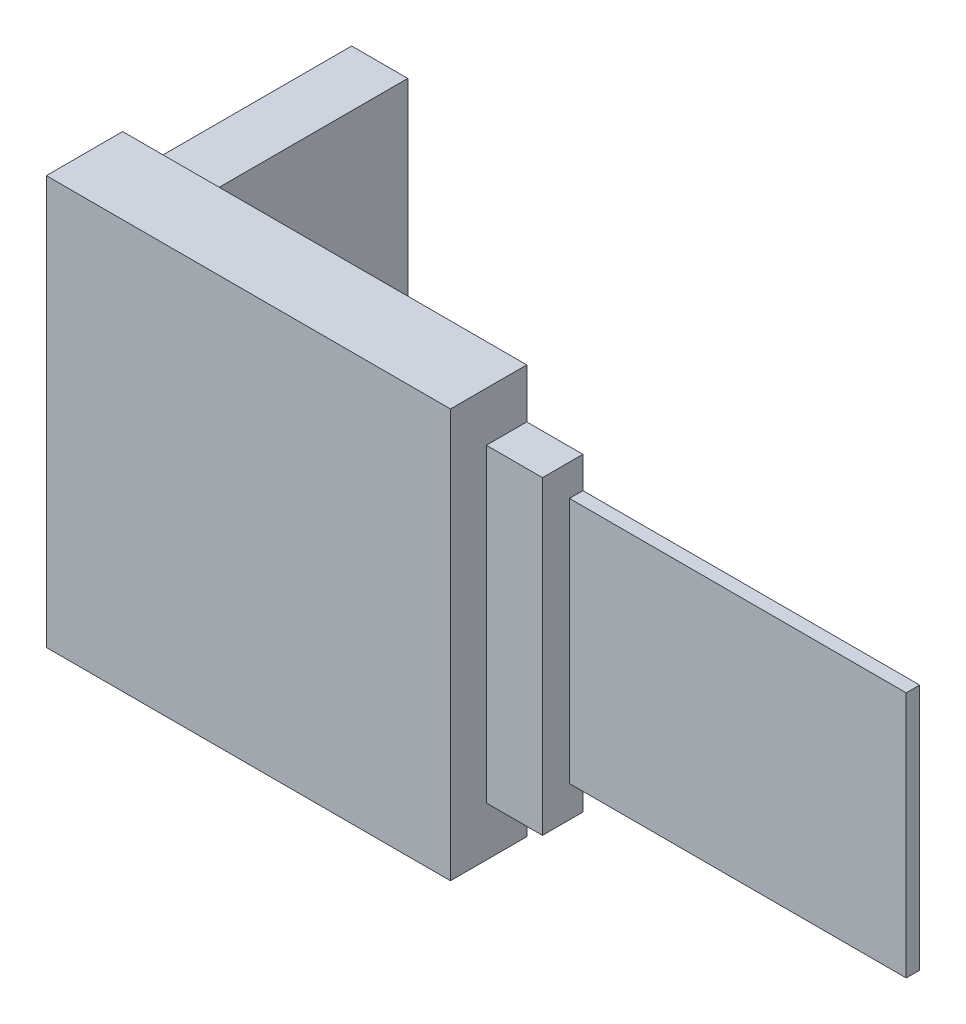
ISO-10303-21;
HEADER;
FILE_DESCRIPTION(('STEP AP214'),'2;1');
FILE_NAME('part.step','',(''),(''),'','','');
FILE_SCHEMA(('AUTOMOTIVE_DESIGN { 1 0 10303 214 1 1 1 1 }'));
ENDSEC;
DATA;
#1=APPLICATION_CONTEXT('core data for automotive mechanical design processes');
#2=APPLICATION_PROTOCOL_DEFINITION('international standard','automotive_design',2000,#1);
#3=PRODUCT_CONTEXT('',#1,'mechanical');
#4=PRODUCT('Part','Part','',(#3));
#5=PRODUCT_RELATED_PRODUCT_CATEGORY('part','',(#4));
#6=PRODUCT_DEFINITION_FORMATION('','',#4);
#7=PRODUCT_DEFINITION_CONTEXT('part definition',#1,'design');
#8=PRODUCT_DEFINITION('design','',#6,#7);
#9=PRODUCT_DEFINITION_SHAPE('','',#8);
#10=(LENGTH_UNIT() NAMED_UNIT(*) SI_UNIT(.MILLI.,.METRE.));
#11=(NAMED_UNIT(*) PLANE_ANGLE_UNIT() SI_UNIT($,.RADIAN.));
#12=(NAMED_UNIT(*) SI_UNIT($,.STERADIAN.) SOLID_ANGLE_UNIT());
#13=UNCERTAINTY_MEASURE_WITH_UNIT(LENGTH_MEASURE(1.E-05),#10,'distance_accuracy_value','');
#14=(GEOMETRIC_REPRESENTATION_CONTEXT(3) GLOBAL_UNCERTAINTY_ASSIGNED_CONTEXT((#13)) GLOBAL_UNIT_ASSIGNED_CONTEXT((#10,
#11,#12)) REPRESENTATION_CONTEXT('',''));
#15=CARTESIAN_POINT('',(0.,0.,0.));
#16=DIRECTION('',(0.,0.,1.));
#17=DIRECTION('',(1.,0.,0.));
#18=AXIS2_PLACEMENT_3D('',#15,#16,#17);
#19=CARTESIAN_POINT('',(-30.0344801548384,-68.5074440446685,3.4));
#20=DIRECTION('',(-1.,0.,0.));
#21=DIRECTION('',(0.,-1.,0.));
#22=AXIS2_PLACEMENT_3D('',#19,#20,#21);
#23=PLANE('',#22);
#24=DIRECTION('',(0.,0.,-1.));
#25=VECTOR('',#24,1.);
#26=CARTESIAN_POINT('',(-30.0344801548384,-84.5074440446685,1.8));
#27=LINE('',#26,#25);
#28=CARTESIAN_POINT('',(-30.0344801548384,-84.5074440446685,1.8));
#29=VERTEX_POINT('',#28);
#30=CARTESIAN_POINT('',(-30.0344801548384,-84.5074440446685,0.));
#31=VERTEX_POINT('',#30);
#32=EDGE_CURVE('E209',#29,#31,#27,.T.);
#33=ORIENTED_EDGE('',*,*,#32,.F.);
#34=DIRECTION('',(0.,1.,0.));
#35=VECTOR('',#34,1.);
#36=CARTESIAN_POINT('',(-30.0344801548384,-84.5074440446685,1.8));
#37=LINE('',#36,#35);
#38=CARTESIAN_POINT('',(-30.0344801548384,-70.7074440446685,1.8));
#39=VERTEX_POINT('',#38);
#40=EDGE_CURVE('E190',#29,#39,#37,.T.);
#41=ORIENTED_EDGE('',*,*,#40,.T.);
#42=DIRECTION('',(0.,0.,-1.));
#43=VECTOR('',#42,1.);
#44=CARTESIAN_POINT('',(-30.0344801548384,-70.7074440446685,1.8));
#45=LINE('',#44,#43);
#46=CARTESIAN_POINT('',(-30.0344801548384,-70.7074440446685,0.));
#47=VERTEX_POINT('',#46);
#48=EDGE_CURVE('E207',#39,#47,#45,.T.);
#49=ORIENTED_EDGE('',*,*,#48,.T.);
#50=DIRECTION('',(0.,1.,0.));
#51=VECTOR('',#50,1.);
#52=CARTESIAN_POINT('',(-30.0344801548384,-68.5074440446685,0.));
#53=LINE('',#52,#51);
#54=CARTESIAN_POINT('',(-30.0344801548384,-68.5074440446685,0.));
#55=VERTEX_POINT('',#54);
#56=EDGE_CURVE('E261',#47,#55,#53,.T.);
#57=ORIENTED_EDGE('',*,*,#56,.T.);
#58=DIRECTION('',(0.,0.,-1.));
#59=VECTOR('',#58,1.);
#60=CARTESIAN_POINT('',(-30.0344801548384,-68.5074440446685,3.4));
#61=LINE('',#60,#59);
#62=CARTESIAN_POINT('',(-30.0344801548384,-68.5074440446685,3.4));
#63=VERTEX_POINT('',#62);
#64=EDGE_CURVE('E268',#63,#55,#61,.T.);
#65=ORIENTED_EDGE('',*,*,#64,.F.);
#66=DIRECTION('',(0.,1.,0.));
#67=VECTOR('',#66,1.);
#68=CARTESIAN_POINT('',(-30.0344801548384,-68.5074440446685,3.4));
#69=LINE('',#68,#67);
#70=CARTESIAN_POINT('',(-30.0344801548384,-86.7074440446685,3.4));
#71=VERTEX_POINT('',#70);
#72=EDGE_CURVE('E252',#71,#63,#69,.T.);
#73=ORIENTED_EDGE('',*,*,#72,.F.);
#74=DIRECTION('',(0.,0.,-1.));
#75=VECTOR('',#74,1.);
#76=CARTESIAN_POINT('',(-30.0344801548384,-86.7074440446685,3.4));
#77=LINE('',#76,#75);
#78=CARTESIAN_POINT('',(-30.0344801548384,-86.7074440446685,0.));
#79=VERTEX_POINT('',#78);
#80=EDGE_CURVE('E41',#71,#79,#77,.T.);
#81=ORIENTED_EDGE('',*,*,#80,.T.);
#82=EDGE_CURVE('E262',#79,#31,#53,.T.);
#83=ORIENTED_EDGE('',*,*,#82,.T.);
#84=EDGE_LOOP('',(#33,#41,#49,#57,#65,#73,#81,#83));
#85=FACE_BOUND('',#84,.T.);
#86=ADVANCED_FACE('F33',(#85),#23,.F.);
#87=CARTESIAN_POINT('',(0.,0.,0.));
#88=DIRECTION('',(0.,0.,1.));
#89=DIRECTION('',(1.,0.,0.));
#90=AXIS2_PLACEMENT_3D('',#87,#88,#89);
#91=PLANE('',#90);
#92=DIRECTION('',(0.,-1.,0.));
#93=VECTOR('',#92,1.);
#94=CARTESIAN_POINT('',(-48.0344801548384,-68.5074440446685,0.));
#95=LINE('',#94,#93);
#96=CARTESIAN_POINT('',(-48.0344801548384,-68.5074440446685,0.));
#97=VERTEX_POINT('',#96);
#98=CARTESIAN_POINT('',(-48.0344801548384,-86.7074440446685,0.));
#99=VERTEX_POINT('',#98);
#100=EDGE_CURVE('E245',#97,#99,#95,.T.);
#101=ORIENTED_EDGE('',*,*,#100,.F.);
#102=DIRECTION('',(-1.,0.,0.));
#103=VECTOR('',#102,1.);
#104=CARTESIAN_POINT('',(-48.0344801548384,-68.5074440446685,0.));
#105=LINE('',#104,#103);
#106=EDGE_CURVE('E250',#55,#97,#105,.T.);
#107=ORIENTED_EDGE('',*,*,#106,.F.);
#108=ORIENTED_EDGE('',*,*,#56,.F.);
#109=DIRECTION('',(1.,0.,0.));
#110=VECTOR('',#109,1.);
#111=CARTESIAN_POINT('',(-27.5344801548384,-70.7074440446685,0.));
#112=LINE('',#111,#110);
#113=CARTESIAN_POINT('',(-27.5344801548384,-70.7074440446685,0.));
#114=VERTEX_POINT('',#113);
#115=EDGE_CURVE('E56',#47,#114,#112,.T.);
#116=ORIENTED_EDGE('',*,*,#115,.T.);
#117=DIRECTION('',(0.,-1.,0.));
#118=VECTOR('',#117,1.);
#119=CARTESIAN_POINT('',(-27.5344801548384,-84.5074440446685,0.));
#120=LINE('',#119,#118);
#121=CARTESIAN_POINT('',(-27.5344801548384,-72.1074440446685,0.));
#122=VERTEX_POINT('',#121);
#123=EDGE_CURVE('E197',#114,#122,#120,.T.);
#124=ORIENTED_EDGE('',*,*,#123,.T.);
#125=DIRECTION('',(1.,0.,0.));
#126=VECTOR('',#125,1.);
#127=CARTESIAN_POINT('',(-12.5344801548384,-72.1074440446685,0.));
#128=LINE('',#127,#126);
#129=CARTESIAN_POINT('',(-12.5344801548384,-72.1074440446685,0.));
#130=VERTEX_POINT('',#129);
#131=EDGE_CURVE('E48',#122,#130,#128,.T.);
#132=ORIENTED_EDGE('',*,*,#131,.T.);
#133=DIRECTION('',(0.,-1.,0.));
#134=VECTOR('',#133,1.);
#135=CARTESIAN_POINT('',(-12.5344801548384,-72.1074440446685,0.));
#136=LINE('',#135,#134);
#137=CARTESIAN_POINT('',(-12.5344801548384,-83.1074440446685,0.));
#138=VERTEX_POINT('',#137);
#139=EDGE_CURVE('E176',#130,#138,#136,.T.);
#140=ORIENTED_EDGE('',*,*,#139,.T.);
#141=DIRECTION('',(-1.,0.,0.));
#142=VECTOR('',#141,1.);
#143=CARTESIAN_POINT('',(-12.5344801548384,-83.1074440446685,0.));
#144=LINE('',#143,#142);
#145=CARTESIAN_POINT('',(-27.5344801548384,-83.1074440446685,0.));
#146=VERTEX_POINT('',#145);
#147=EDGE_CURVE('E152',#138,#146,#144,.T.);
#148=ORIENTED_EDGE('',*,*,#147,.T.);
#149=CARTESIAN_POINT('',(-27.5344801548384,-84.5074440446685,0.));
#150=VERTEX_POINT('',#149);
#151=EDGE_CURVE('E180',#146,#150,#120,.T.);
#152=ORIENTED_EDGE('',*,*,#151,.T.);
#153=DIRECTION('',(-1.,0.,0.));
#154=VECTOR('',#153,1.);
#155=CARTESIAN_POINT('',(-27.5344801548384,-84.5074440446685,0.));
#156=LINE('',#155,#154);
#157=EDGE_CURVE('E200',#150,#31,#156,.T.);
#158=ORIENTED_EDGE('',*,*,#157,.T.);
#159=ORIENTED_EDGE('',*,*,#82,.F.);
#160=DIRECTION('',(1.,0.,0.));
#161=VECTOR('',#160,1.);
#162=CARTESIAN_POINT('',(-48.0344801548384,-86.7074440446685,0.));
#163=LINE('',#162,#161);
#164=EDGE_CURVE('E259',#99,#79,#163,.T.);
#165=ORIENTED_EDGE('',*,*,#164,.F.);
#166=EDGE_LOOP('',(#101,#107,#108,#116,#124,#132,#140,#148,#152,#158,#159,#165));
#167=FACE_BOUND('',#166,.T.);
#168=DIRECTION('',(0.,1.,0.));
#169=VECTOR('',#168,1.);
#170=CARTESIAN_POINT('',(-47.8344801548384,-85.1074440446685,0.));
#171=LINE('',#170,#169);
#172=CARTESIAN_POINT('',(-47.8344801548384,-85.1074440446685,0.));
#173=VERTEX_POINT('',#172);
#174=CARTESIAN_POINT('',(-47.8344801548384,-70.1074440446685,0.));
#175=VERTEX_POINT('',#174);
#176=EDGE_CURVE('E206',#173,#175,#171,.T.);
#177=ORIENTED_EDGE('',*,*,#176,.F.);
#178=DIRECTION('',(-1.,0.,0.));
#179=VECTOR('',#178,1.);
#180=CARTESIAN_POINT('',(-47.8344801548384,-85.1074440446685,0.));
#181=LINE('',#180,#179);
#182=CARTESIAN_POINT('',(-45.3344801548384,-85.1074440446685,0.));
#183=VERTEX_POINT('',#182);
#184=EDGE_CURVE('E217',#183,#173,#181,.T.);
#185=ORIENTED_EDGE('',*,*,#184,.F.);
#186=DIRECTION('',(0.,-1.,0.));
#187=VECTOR('',#186,1.);
#188=CARTESIAN_POINT('',(-45.3344801548384,-85.1074440446685,0.));
#189=LINE('',#188,#187);
#190=CARTESIAN_POINT('',(-45.3344801548384,-70.1074440446685,0.));
#191=VERTEX_POINT('',#190);
#192=EDGE_CURVE('E229',#191,#183,#189,.T.);
#193=ORIENTED_EDGE('',*,*,#192,.F.);
#194=DIRECTION('',(1.,0.,0.));
#195=VECTOR('',#194,1.);
#196=CARTESIAN_POINT('',(-47.8344801548384,-70.1074440446685,0.));
#197=LINE('',#196,#195);
#198=EDGE_CURVE('E226',#175,#191,#197,.T.);
#199=ORIENTED_EDGE('',*,*,#198,.F.);
#200=EDGE_LOOP('',(#177,#185,#193,#199));
#201=FACE_BOUND('',#200,.T.);
#202=ADVANCED_FACE('F280',(#167,#201),#91,.F.);
#203=CARTESIAN_POINT('',(-48.0344801548384,-68.5074440446685,3.4));
#204=DIRECTION('',(1.,0.,0.));
#205=DIRECTION('',(0.,0.,-1.));
#206=AXIS2_PLACEMENT_3D('',#203,#204,#205);
#207=PLANE('',#206);
#208=ORIENTED_EDGE('',*,*,#100,.T.);
#209=DIRECTION('',(0.,0.,-1.));
#210=VECTOR('',#209,1.);
#211=CARTESIAN_POINT('',(-48.0344801548384,-86.7074440446685,3.4));
#212=LINE('',#211,#210);
#213=CARTESIAN_POINT('',(-48.0344801548384,-86.7074440446685,3.4));
#214=VERTEX_POINT('',#213);
#215=EDGE_CURVE('E11',#214,#99,#212,.T.);
#216=ORIENTED_EDGE('',*,*,#215,.F.);
#217=DIRECTION('',(0.,-1.,0.));
#218=VECTOR('',#217,1.);
#219=CARTESIAN_POINT('',(-48.0344801548384,-68.5074440446685,3.4));
#220=LINE('',#219,#218);
#221=CARTESIAN_POINT('',(-48.0344801548384,-68.5074440446685,3.4));
#222=VERTEX_POINT('',#221);
#223=EDGE_CURVE('E246',#222,#214,#220,.T.);
#224=ORIENTED_EDGE('',*,*,#223,.F.);
#225=DIRECTION('',(0.,0.,-1.));
#226=VECTOR('',#225,1.);
#227=CARTESIAN_POINT('',(-48.0344801548384,-68.5074440446685,3.4));
#228=LINE('',#227,#226);
#229=EDGE_CURVE('E256',#222,#97,#228,.T.);
#230=ORIENTED_EDGE('',*,*,#229,.T.);
#231=EDGE_LOOP('',(#208,#216,#224,#230));
#232=FACE_BOUND('',#231,.T.);
#233=ADVANCED_FACE('F35',(#232),#207,.F.);
#234=CARTESIAN_POINT('',(-48.0344801548384,-86.7074440446685,3.4));
#235=DIRECTION('',(0.,1.,0.));
#236=DIRECTION('',(0.,0.,1.));
#237=AXIS2_PLACEMENT_3D('',#234,#235,#236);
#238=PLANE('',#237);
#239=ORIENTED_EDGE('',*,*,#164,.T.);
#240=ORIENTED_EDGE('',*,*,#80,.F.);
#241=DIRECTION('',(1.,0.,0.));
#242=VECTOR('',#241,1.);
#243=CARTESIAN_POINT('',(-48.0344801548384,-86.7074440446685,3.4));
#244=LINE('',#243,#242);
#245=EDGE_CURVE('E249',#214,#71,#244,.T.);
#246=ORIENTED_EDGE('',*,*,#245,.F.);
#247=ORIENTED_EDGE('',*,*,#215,.T.);
#248=EDGE_LOOP('',(#239,#240,#246,#247));
#249=FACE_BOUND('',#248,.T.);
#250=ADVANCED_FACE('F305',(#249),#238,.F.);
#251=CARTESIAN_POINT('',(-48.0344801548384,-68.5074440446685,3.4));
#252=DIRECTION('',(0.,-1.,0.));
#253=DIRECTION('',(1.,0.,0.));
#254=AXIS2_PLACEMENT_3D('',#251,#252,#253);
#255=PLANE('',#254);
#256=ORIENTED_EDGE('',*,*,#106,.T.);
#257=ORIENTED_EDGE('',*,*,#229,.F.);
#258=DIRECTION('',(-1.,0.,0.));
#259=VECTOR('',#258,1.);
#260=CARTESIAN_POINT('',(-48.0344801548384,-68.5074440446685,3.4));
#261=LINE('',#260,#259);
#262=EDGE_CURVE('E254',#63,#222,#261,.T.);
#263=ORIENTED_EDGE('',*,*,#262,.F.);
#264=ORIENTED_EDGE('',*,*,#64,.T.);
#265=EDGE_LOOP('',(#256,#257,#263,#264));
#266=FACE_BOUND('',#265,.T.);
#267=ADVANCED_FACE('F299',(#266),#255,.F.);
#268=CARTESIAN_POINT('',(0.,0.,3.4));
#269=DIRECTION('',(0.,0.,1.));
#270=DIRECTION('',(1.,0.,0.));
#271=AXIS2_PLACEMENT_3D('',#268,#269,#270);
#272=PLANE('',#271);
#273=ORIENTED_EDGE('',*,*,#223,.T.);
#274=ORIENTED_EDGE('',*,*,#245,.T.);
#275=ORIENTED_EDGE('',*,*,#72,.T.);
#276=ORIENTED_EDGE('',*,*,#262,.T.);
#277=EDGE_LOOP('',(#273,#274,#275,#276));
#278=FACE_BOUND('',#277,.T.);
#279=ADVANCED_FACE('F303',(#278),#272,.T.);
#280=CARTESIAN_POINT('',(-47.8344801548384,-85.1074440446685,-10.));
#281=DIRECTION('',(1.,0.,0.));
#282=DIRECTION('',(0.,0.,-1.));
#283=AXIS2_PLACEMENT_3D('',#280,#281,#282);
#284=PLANE('',#283);
#285=ORIENTED_EDGE('',*,*,#176,.T.);
#286=DIRECTION('',(0.,0.,1.));
#287=VECTOR('',#286,1.);
#288=CARTESIAN_POINT('',(-47.8344801548384,-70.1074440446685,-10.));
#289=LINE('',#288,#287);
#290=CARTESIAN_POINT('',(-47.8344801548384,-70.1074440446685,-10.));
#291=VERTEX_POINT('',#290);
#292=EDGE_CURVE('E242',#291,#175,#289,.T.);
#293=ORIENTED_EDGE('',*,*,#292,.F.);
#294=DIRECTION('',(0.,1.,0.));
#295=VECTOR('',#294,1.);
#296=CARTESIAN_POINT('',(-47.8344801548384,-85.1074440446685,-10.));
#297=LINE('',#296,#295);
#298=CARTESIAN_POINT('',(-47.8344801548384,-85.1074440446685,-10.));
#299=VERTEX_POINT('',#298);
#300=EDGE_CURVE('E213',#299,#291,#297,.T.);
#301=ORIENTED_EDGE('',*,*,#300,.F.);
#302=DIRECTION('',(0.,0.,1.));
#303=VECTOR('',#302,1.);
#304=CARTESIAN_POINT('',(-47.8344801548384,-85.1074440446685,-10.));
#305=LINE('',#304,#303);
#306=EDGE_CURVE('E223',#299,#173,#305,.T.);
#307=ORIENTED_EDGE('',*,*,#306,.T.);
#308=EDGE_LOOP('',(#285,#293,#301,#307));
#309=FACE_BOUND('',#308,.T.);
#310=ADVANCED_FACE('F324',(#309),#284,.F.);
#311=CARTESIAN_POINT('',(-47.8344801548384,-70.1074440446685,-10.));
#312=DIRECTION('',(0.,-1.,0.));
#313=DIRECTION('',(0.,0.,-1.));
#314=AXIS2_PLACEMENT_3D('',#311,#312,#313);
#315=PLANE('',#314);
#316=ORIENTED_EDGE('',*,*,#198,.T.);
#317=DIRECTION('',(0.,0.,1.));
#318=VECTOR('',#317,1.);
#319=CARTESIAN_POINT('',(-45.3344801548384,-70.1074440446685,-10.));
#320=LINE('',#319,#318);
#321=CARTESIAN_POINT('',(-45.3344801548384,-70.1074440446685,-10.));
#322=VERTEX_POINT('',#321);
#323=EDGE_CURVE('E239',#322,#191,#320,.T.);
#324=ORIENTED_EDGE('',*,*,#323,.F.);
#325=DIRECTION('',(1.,0.,0.));
#326=VECTOR('',#325,1.);
#327=CARTESIAN_POINT('',(-47.8344801548384,-70.1074440446685,-10.));
#328=LINE('',#327,#326);
#329=EDGE_CURVE('E216',#291,#322,#328,.T.);
#330=ORIENTED_EDGE('',*,*,#329,.F.);
#331=ORIENTED_EDGE('',*,*,#292,.T.);
#332=EDGE_LOOP('',(#316,#324,#330,#331));
#333=FACE_BOUND('',#332,.T.);
#334=ADVANCED_FACE('F327',(#333),#315,.F.);
#335=CARTESIAN_POINT('',(-45.3344801548384,-85.1074440446685,-10.));
#336=DIRECTION('',(-1.,0.,0.));
#337=DIRECTION('',(0.,0.,1.));
#338=AXIS2_PLACEMENT_3D('',#335,#336,#337);
#339=PLANE('',#338);
#340=ORIENTED_EDGE('',*,*,#192,.T.);
#341=DIRECTION('',(0.,0.,1.));
#342=VECTOR('',#341,1.);
#343=CARTESIAN_POINT('',(-45.3344801548384,-85.1074440446685,-10.));
#344=LINE('',#343,#342);
#345=CARTESIAN_POINT('',(-45.3344801548384,-85.1074440446685,-10.));
#346=VERTEX_POINT('',#345);
#347=EDGE_CURVE('E236',#346,#183,#344,.T.);
#348=ORIENTED_EDGE('',*,*,#347,.F.);
#349=DIRECTION('',(0.,-1.,0.));
#350=VECTOR('',#349,1.);
#351=CARTESIAN_POINT('',(-45.3344801548384,-85.1074440446685,-10.));
#352=LINE('',#351,#350);
#353=EDGE_CURVE('E219',#322,#346,#352,.T.);
#354=ORIENTED_EDGE('',*,*,#353,.F.);
#355=ORIENTED_EDGE('',*,*,#323,.T.);
#356=EDGE_LOOP('',(#340,#348,#354,#355));
#357=FACE_BOUND('',#356,.T.);
#358=ADVANCED_FACE('F331',(#357),#339,.F.);
#359=CARTESIAN_POINT('',(-47.8344801548384,-85.1074440446685,-10.));
#360=DIRECTION('',(0.,1.,0.));
#361=DIRECTION('',(0.,0.,1.));
#362=AXIS2_PLACEMENT_3D('',#359,#360,#361);
#363=PLANE('',#362);
#364=ORIENTED_EDGE('',*,*,#184,.T.);
#365=ORIENTED_EDGE('',*,*,#306,.F.);
#366=DIRECTION('',(-1.,0.,0.));
#367=VECTOR('',#366,1.);
#368=CARTESIAN_POINT('',(-47.8344801548384,-85.1074440446685,-10.));
#369=LINE('',#368,#367);
#370=EDGE_CURVE('E221',#346,#299,#369,.T.);
#371=ORIENTED_EDGE('',*,*,#370,.F.);
#372=ORIENTED_EDGE('',*,*,#347,.T.);
#373=EDGE_LOOP('',(#364,#365,#371,#372));
#374=FACE_BOUND('',#373,.T.);
#375=ADVANCED_FACE('F335',(#374),#363,.F.);
#376=CARTESIAN_POINT('',(0.,0.,-10.));
#377=DIRECTION('',(0.,0.,-1.));
#378=DIRECTION('',(-1.,0.,0.));
#379=AXIS2_PLACEMENT_3D('',#376,#377,#378);
#380=PLANE('',#379);
#381=ORIENTED_EDGE('',*,*,#300,.T.);
#382=ORIENTED_EDGE('',*,*,#329,.T.);
#383=ORIENTED_EDGE('',*,*,#353,.T.);
#384=ORIENTED_EDGE('',*,*,#370,.T.);
#385=EDGE_LOOP('',(#381,#382,#383,#384));
#386=FACE_BOUND('',#385,.T.);
#387=ADVANCED_FACE('F339',(#386),#380,.T.);
#388=CARTESIAN_POINT('',(-27.5344801548384,-84.5074440446685,1.8));
#389=DIRECTION('',(1.,0.,0.));
#390=DIRECTION('',(0.,0.,-1.));
#391=AXIS2_PLACEMENT_3D('',#388,#389,#390);
#392=PLANE('',#391);
#393=DIRECTION('',(0.,0.,-1.));
#394=VECTOR('',#393,1.);
#395=CARTESIAN_POINT('',(-27.5344801548384,-83.1074440446685,0.6));
#396=LINE('',#395,#394);
#397=CARTESIAN_POINT('',(-27.5344801548384,-83.1074440446685,0.6));
#398=VERTEX_POINT('',#397);
#399=EDGE_CURVE('E157',#398,#146,#396,.T.);
#400=ORIENTED_EDGE('',*,*,#399,.F.);
#401=DIRECTION('',(0.,1.,0.));
#402=VECTOR('',#401,1.);
#403=CARTESIAN_POINT('',(-27.5344801548384,-72.1074440446685,0.6));
#404=LINE('',#403,#402);
#405=CARTESIAN_POINT('',(-27.5344801548384,-72.1074440446685,0.6));
#406=VERTEX_POINT('',#405);
#407=EDGE_CURVE('E167',#398,#406,#404,.T.);
#408=ORIENTED_EDGE('',*,*,#407,.T.);
#409=DIRECTION('',(0.,0.,-1.));
#410=VECTOR('',#409,1.);
#411=CARTESIAN_POINT('',(-27.5344801548384,-72.1074440446685,0.6));
#412=LINE('',#411,#410);
#413=EDGE_CURVE('E181',#406,#122,#412,.T.);
#414=ORIENTED_EDGE('',*,*,#413,.T.);
#415=ORIENTED_EDGE('',*,*,#123,.F.);
#416=DIRECTION('',(0.,0.,-1.));
#417=VECTOR('',#416,1.);
#418=CARTESIAN_POINT('',(-27.5344801548384,-70.7074440446685,1.8));
#419=LINE('',#418,#417);
#420=CARTESIAN_POINT('',(-27.5344801548384,-70.7074440446685,1.8));
#421=VERTEX_POINT('',#420);
#422=EDGE_CURVE('E204',#421,#114,#419,.T.);
#423=ORIENTED_EDGE('',*,*,#422,.F.);
#424=DIRECTION('',(0.,-1.,0.));
#425=VECTOR('',#424,1.);
#426=CARTESIAN_POINT('',(-27.5344801548384,-84.5074440446685,1.8));
#427=LINE('',#426,#425);
#428=CARTESIAN_POINT('',(-27.5344801548384,-84.5074440446685,1.8));
#429=VERTEX_POINT('',#428);
#430=EDGE_CURVE('E184',#421,#429,#427,.T.);
#431=ORIENTED_EDGE('',*,*,#430,.T.);
#432=DIRECTION('',(0.,0.,-1.));
#433=VECTOR('',#432,1.);
#434=CARTESIAN_POINT('',(-27.5344801548384,-84.5074440446685,1.8));
#435=LINE('',#434,#433);
#436=EDGE_CURVE('E196',#429,#150,#435,.T.);
#437=ORIENTED_EDGE('',*,*,#436,.T.);
#438=ORIENTED_EDGE('',*,*,#151,.F.);
#439=EDGE_LOOP('',(#400,#408,#414,#415,#423,#431,#437,#438));
#440=FACE_BOUND('',#439,.T.);
#441=ADVANCED_FACE('F295',(#440),#392,.T.);
#442=CARTESIAN_POINT('',(-27.5344801548384,-70.7074440446685,1.8));
#443=DIRECTION('',(0.,1.,0.));
#444=DIRECTION('',(0.,0.,1.));
#445=AXIS2_PLACEMENT_3D('',#442,#443,#444);
#446=PLANE('',#445);
#447=ORIENTED_EDGE('',*,*,#115,.F.);
#448=ORIENTED_EDGE('',*,*,#48,.F.);
#449=DIRECTION('',(1.,0.,0.));
#450=VECTOR('',#449,1.);
#451=CARTESIAN_POINT('',(-27.5344801548384,-70.7074440446685,1.8));
#452=LINE('',#451,#450);
#453=EDGE_CURVE('E193',#39,#421,#452,.T.);
#454=ORIENTED_EDGE('',*,*,#453,.T.);
#455=ORIENTED_EDGE('',*,*,#422,.T.);
#456=EDGE_LOOP('',(#447,#448,#454,#455));
#457=FACE_BOUND('',#456,.T.);
#458=ADVANCED_FACE('F292',(#457),#446,.T.);
#459=CARTESIAN_POINT('',(-27.5344801548384,-84.5074440446685,1.8));
#460=DIRECTION('',(0.,-1.,0.));
#461=DIRECTION('',(0.,0.,-1.));
#462=AXIS2_PLACEMENT_3D('',#459,#460,#461);
#463=PLANE('',#462);
#464=ORIENTED_EDGE('',*,*,#157,.F.);
#465=ORIENTED_EDGE('',*,*,#436,.F.);
#466=DIRECTION('',(-1.,0.,0.));
#467=VECTOR('',#466,1.);
#468=CARTESIAN_POINT('',(-27.5344801548384,-84.5074440446685,1.8));
#469=LINE('',#468,#467);
#470=EDGE_CURVE('E187',#429,#29,#469,.T.);
#471=ORIENTED_EDGE('',*,*,#470,.T.);
#472=ORIENTED_EDGE('',*,*,#32,.T.);
#473=EDGE_LOOP('',(#464,#465,#471,#472));
#474=FACE_BOUND('',#473,.T.);
#475=ADVANCED_FACE('F285',(#474),#463,.T.);
#476=CARTESIAN_POINT('',(0.,0.,1.8));
#477=DIRECTION('',(0.,0.,1.));
#478=DIRECTION('',(1.,0.,0.));
#479=AXIS2_PLACEMENT_3D('',#476,#477,#478);
#480=PLANE('',#479);
#481=ORIENTED_EDGE('',*,*,#430,.F.);
#482=ORIENTED_EDGE('',*,*,#453,.F.);
#483=ORIENTED_EDGE('',*,*,#40,.F.);
#484=ORIENTED_EDGE('',*,*,#470,.F.);
#485=EDGE_LOOP('',(#481,#482,#483,#484));
#486=FACE_BOUND('',#485,.T.);
#487=ADVANCED_FACE('F291',(#486),#480,.T.);
#488=CARTESIAN_POINT('',(-12.5344801548384,-72.1074440446685,0.6));
#489=DIRECTION('',(1.,0.,0.));
#490=DIRECTION('',(0.,1.,0.));
#491=AXIS2_PLACEMENT_3D('',#488,#489,#490);
#492=PLANE('',#491);
#493=ORIENTED_EDGE('',*,*,#139,.F.);
#494=DIRECTION('',(0.,0.,-1.));
#495=VECTOR('',#494,1.);
#496=CARTESIAN_POINT('',(-12.5344801548384,-72.1074440446685,0.6));
#497=LINE('',#496,#495);
#498=CARTESIAN_POINT('',(-12.5344801548384,-72.1074440446685,0.6));
#499=VERTEX_POINT('',#498);
#500=EDGE_CURVE('E170',#499,#130,#497,.T.);
#501=ORIENTED_EDGE('',*,*,#500,.F.);
#502=DIRECTION('',(0.,-1.,0.));
#503=VECTOR('',#502,1.);
#504=CARTESIAN_POINT('',(-12.5344801548384,-72.1074440446685,0.6));
#505=LINE('',#504,#503);
#506=CARTESIAN_POINT('',(-12.5344801548384,-83.1074440446685,0.6));
#507=VERTEX_POINT('',#506);
#508=EDGE_CURVE('E164',#499,#507,#505,.T.);
#509=ORIENTED_EDGE('',*,*,#508,.T.);
#510=DIRECTION('',(0.,0.,-1.));
#511=VECTOR('',#510,1.);
#512=CARTESIAN_POINT('',(-12.5344801548384,-83.1074440446685,0.6));
#513=LINE('',#512,#511);
#514=EDGE_CURVE('E146',#507,#138,#513,.T.);
#515=ORIENTED_EDGE('',*,*,#514,.T.);
#516=EDGE_LOOP('',(#493,#501,#509,#515));
#517=FACE_BOUND('',#516,.T.);
#518=ADVANCED_FACE('F169',(#517),#492,.T.);
#519=CARTESIAN_POINT('',(-12.5344801548384,-72.1074440446685,0.6));
#520=DIRECTION('',(0.,1.,0.));
#521=DIRECTION('',(-1.,0.,0.));
#522=AXIS2_PLACEMENT_3D('',#519,#520,#521);
#523=PLANE('',#522);
#524=ORIENTED_EDGE('',*,*,#131,.F.);
#525=ORIENTED_EDGE('',*,*,#413,.F.);
#526=DIRECTION('',(1.,0.,0.));
#527=VECTOR('',#526,1.);
#528=CARTESIAN_POINT('',(-12.5344801548384,-72.1074440446685,0.6));
#529=LINE('',#528,#527);
#530=EDGE_CURVE('E158',#406,#499,#529,.T.);
#531=ORIENTED_EDGE('',*,*,#530,.T.);
#532=ORIENTED_EDGE('',*,*,#500,.T.);
#533=EDGE_LOOP('',(#524,#525,#531,#532));
#534=FACE_BOUND('',#533,.T.);
#535=ADVANCED_FACE('F354',(#534),#523,.T.);
#536=CARTESIAN_POINT('',(-12.5344801548384,-83.1074440446685,0.6));
#537=DIRECTION('',(0.,-1.,0.));
#538=DIRECTION('',(0.,0.,-1.));
#539=AXIS2_PLACEMENT_3D('',#536,#537,#538);
#540=PLANE('',#539);
#541=ORIENTED_EDGE('',*,*,#147,.F.);
#542=ORIENTED_EDGE('',*,*,#514,.F.);
#543=DIRECTION('',(-1.,0.,0.));
#544=VECTOR('',#543,1.);
#545=CARTESIAN_POINT('',(-12.5344801548384,-83.1074440446685,0.6));
#546=LINE('',#545,#544);
#547=EDGE_CURVE('E149',#507,#398,#546,.T.);
#548=ORIENTED_EDGE('',*,*,#547,.T.);
#549=ORIENTED_EDGE('',*,*,#399,.T.);
#550=EDGE_LOOP('',(#541,#542,#548,#549));
#551=FACE_BOUND('',#550,.T.);
#552=ADVANCED_FACE('F148',(#551),#540,.T.);
#553=CARTESIAN_POINT('',(0.,0.,0.6));
#554=DIRECTION('',(0.,0.,-1.));
#555=DIRECTION('',(-1.,0.,0.));
#556=AXIS2_PLACEMENT_3D('',#553,#554,#555);
#557=PLANE('',#556);
#558=ORIENTED_EDGE('',*,*,#508,.F.);
#559=ORIENTED_EDGE('',*,*,#530,.F.);
#560=ORIENTED_EDGE('',*,*,#407,.F.);
#561=ORIENTED_EDGE('',*,*,#547,.F.);
#562=EDGE_LOOP('',(#558,#559,#560,#561));
#563=FACE_BOUND('',#562,.T.);
#564=ADVANCED_FACE('F162',(#563),#557,.F.);
#565=CLOSED_SHELL('',(#86,#202,#233,#250,#267,#279,#310,#334,#358,#375,#387,#441,#458,#475,#487,
#518,#535,#552,#564));
#566=MANIFOLD_SOLID_BREP('B2',#565);
#567=ADVANCED_BREP_SHAPE_REPRESENTATION('',(#18,#566),#14);
#568=SHAPE_DEFINITION_REPRESENTATION(#9,#567);
ENDSEC;
END-ISO-10303-21;
